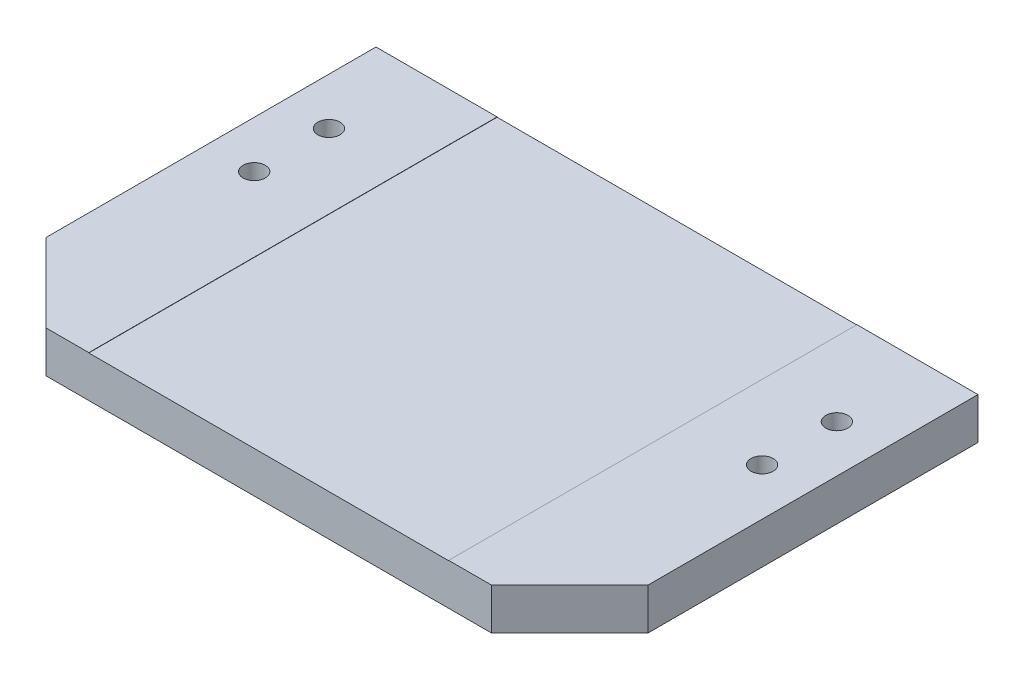
ISO-10303-21;
HEADER;
FILE_DESCRIPTION(('STEP AP214'),'2;1');
FILE_NAME('part.step','',(''),(''),'','','');
FILE_SCHEMA(('AUTOMOTIVE_DESIGN { 1 0 10303 214 1 1 1 1 }'));
ENDSEC;
DATA;
#1=APPLICATION_CONTEXT('core data for automotive mechanical design processes');
#2=APPLICATION_PROTOCOL_DEFINITION('international standard','automotive_design',2000,#1);
#3=PRODUCT_CONTEXT('',#1,'mechanical');
#4=PRODUCT('Part','Part','',(#3));
#5=PRODUCT_RELATED_PRODUCT_CATEGORY('part','',(#4));
#6=PRODUCT_DEFINITION_FORMATION('','',#4);
#7=PRODUCT_DEFINITION_CONTEXT('part definition',#1,'design');
#8=PRODUCT_DEFINITION('design','',#6,#7);
#9=PRODUCT_DEFINITION_SHAPE('','',#8);
#10=(LENGTH_UNIT() NAMED_UNIT(*) SI_UNIT(.MILLI.,.METRE.));
#11=(NAMED_UNIT(*) PLANE_ANGLE_UNIT() SI_UNIT($,.RADIAN.));
#12=(NAMED_UNIT(*) SI_UNIT($,.STERADIAN.) SOLID_ANGLE_UNIT());
#13=UNCERTAINTY_MEASURE_WITH_UNIT(LENGTH_MEASURE(1.E-05),#10,'distance_accuracy_value','');
#14=(GEOMETRIC_REPRESENTATION_CONTEXT(3) GLOBAL_UNCERTAINTY_ASSIGNED_CONTEXT((#13)) GLOBAL_UNIT_ASSIGNED_CONTEXT((#10,
#11,#12)) REPRESENTATION_CONTEXT('',''));
#15=CARTESIAN_POINT('',(0.,0.,0.));
#16=DIRECTION('',(0.,0.,1.));
#17=DIRECTION('',(1.,0.,0.));
#18=AXIS2_PLACEMENT_3D('',#15,#16,#17);
#19=CARTESIAN_POINT('',(0.,1.5,0.));
#20=DIRECTION('',(0.,-1.,0.));
#21=DIRECTION('',(0.,0.,-1.));
#22=AXIS2_PLACEMENT_3D('',#19,#20,#21);
#23=PLANE('',#22);
#24=CARTESIAN_POINT('',(-9.175,1.5,-3.975));
#25=DIRECTION('',(0.,1.,0.));
#26=DIRECTION('',(0.,0.,1.));
#27=AXIS2_PLACEMENT_3D('',#24,#25,#26);
#28=CIRCLE('',#27,0.4);
#29=CARTESIAN_POINT('',(-9.175,1.5,-3.575));
#30=VERTEX_POINT('',#29);
#31=EDGE_CURVE('E262',#30,#30,#28,.T.);
#32=ORIENTED_EDGE('',*,*,#31,.F.);
#33=EDGE_LOOP('',(#32));
#34=FACE_BOUND('',#33,.T.);
#35=CARTESIAN_POINT('',(-9.175,1.5,-1.275));
#36=DIRECTION('',(0.,1.,0.));
#37=DIRECTION('',(0.,0.,1.));
#38=AXIS2_PLACEMENT_3D('',#35,#36,#37);
#39=CIRCLE('',#38,0.399999999999999);
#40=CARTESIAN_POINT('',(-9.175,1.5,-0.874999999999999));
#41=VERTEX_POINT('',#40);
#42=EDGE_CURVE('E157',#41,#41,#39,.T.);
#43=ORIENTED_EDGE('',*,*,#42,.F.);
#44=EDGE_LOOP('',(#43));
#45=FACE_BOUND('',#44,.T.);
#46=DIRECTION('',(1.,0.,0.));
#47=VECTOR('',#46,1.);
#48=CARTESIAN_POINT('',(8.04657287525381,1.5,7.375));
#49=LINE('',#48,#47);
#50=CARTESIAN_POINT('',(-8.04657287525381,1.5,7.375));
#51=VERTEX_POINT('',#50);
#52=CARTESIAN_POINT('',(-6.5,1.5,7.375));
#53=VERTEX_POINT('',#52);
#54=EDGE_CURVE('E128',#51,#53,#49,.T.);
#55=ORIENTED_EDGE('',*,*,#54,.T.);
#56=DIRECTION('',(0.,0.,1.));
#57=VECTOR('',#56,1.);
#58=CARTESIAN_POINT('',(-6.5,1.5,-7.375));
#59=LINE('',#58,#57);
#60=CARTESIAN_POINT('',(-6.5,1.5,-7.375));
#61=VERTEX_POINT('',#60);
#62=EDGE_CURVE('E216',#61,#53,#59,.T.);
#63=ORIENTED_EDGE('',*,*,#62,.F.);
#64=DIRECTION('',(-1.,0.,0.));
#65=VECTOR('',#64,1.);
#66=CARTESIAN_POINT('',(-10.875,1.5,-7.375));
#67=LINE('',#66,#65);
#68=CARTESIAN_POINT('',(-10.875,1.5,-7.375));
#69=VERTEX_POINT('',#68);
#70=EDGE_CURVE('E66',#61,#69,#67,.T.);
#71=ORIENTED_EDGE('',*,*,#70,.T.);
#72=DIRECTION('',(0.,0.,1.));
#73=VECTOR('',#72,1.);
#74=CARTESIAN_POINT('',(-10.875,1.5,4.54657287525381));
#75=LINE('',#74,#73);
#76=CARTESIAN_POINT('',(-10.875,1.5,4.54657287525381));
#77=VERTEX_POINT('',#76);
#78=EDGE_CURVE('E170',#69,#77,#75,.T.);
#79=ORIENTED_EDGE('',*,*,#78,.T.);
#80=DIRECTION('',(0.707106781186547,0.,0.707106781186548));
#81=VECTOR('',#80,1.);
#82=CARTESIAN_POINT('',(-8.04657287525381,1.5,7.375));
#83=LINE('',#82,#81);
#84=EDGE_CURVE('E102',#77,#51,#83,.T.);
#85=ORIENTED_EDGE('',*,*,#84,.T.);
#86=EDGE_LOOP('',(#55,#63,#71,#79,#85));
#87=FACE_BOUND('',#86,.T.);
#88=ADVANCED_FACE('F41',(#34,#45,#87),#23,.F.);
#89=CARTESIAN_POINT('',(10.875,1.5,-7.375));
#90=VERTEX_POINT('',#89);
#91=CARTESIAN_POINT('',(6.5,1.5,-7.375));
#92=VERTEX_POINT('',#91);
#93=EDGE_CURVE('E146',#90,#92,#67,.T.);
#94=ORIENTED_EDGE('',*,*,#93,.T.);
#95=DIRECTION('',(0.,0.,-1.));
#96=VECTOR('',#95,1.);
#97=CARTESIAN_POINT('',(6.5,1.5,-7.375));
#98=LINE('',#97,#96);
#99=CARTESIAN_POINT('',(6.5,1.5,7.375));
#100=VERTEX_POINT('',#99);
#101=EDGE_CURVE('E196',#100,#92,#98,.T.);
#102=ORIENTED_EDGE('',*,*,#101,.F.);
#103=CARTESIAN_POINT('',(8.04657287525381,1.5,7.375));
#104=VERTEX_POINT('',#103);
#105=EDGE_CURVE('E123',#100,#104,#49,.T.);
#106=ORIENTED_EDGE('',*,*,#105,.T.);
#107=DIRECTION('',(0.707106781186548,0.,-0.707106781186547));
#108=VECTOR('',#107,1.);
#109=CARTESIAN_POINT('',(10.875,1.5,4.54657287525381));
#110=LINE('',#109,#108);
#111=CARTESIAN_POINT('',(10.875,1.5,4.54657287525381));
#112=VERTEX_POINT('',#111);
#113=EDGE_CURVE('E113',#104,#112,#110,.T.);
#114=ORIENTED_EDGE('',*,*,#113,.T.);
#115=DIRECTION('',(0.,0.,-1.));
#116=VECTOR('',#115,1.);
#117=CARTESIAN_POINT('',(10.875,1.5,-7.375));
#118=LINE('',#117,#116);
#119=EDGE_CURVE('E119',#112,#90,#118,.T.);
#120=ORIENTED_EDGE('',*,*,#119,.T.);
#121=EDGE_LOOP('',(#94,#102,#106,#114,#120));
#122=FACE_BOUND('',#121,.T.);
#123=CARTESIAN_POINT('',(9.175,1.5,-1.275));
#124=DIRECTION('',(0.,1.,0.));
#125=DIRECTION('',(0.,0.,1.));
#126=AXIS2_PLACEMENT_3D('',#123,#124,#125);
#127=CIRCLE('',#126,0.399999999999999);
#128=CARTESIAN_POINT('',(9.175,1.5,-0.875));
#129=VERTEX_POINT('',#128);
#130=EDGE_CURVE('E254',#129,#129,#127,.T.);
#131=ORIENTED_EDGE('',*,*,#130,.F.);
#132=EDGE_LOOP('',(#131));
#133=FACE_BOUND('',#132,.T.);
#134=CARTESIAN_POINT('',(9.175,1.5,-3.975));
#135=DIRECTION('',(0.,1.,0.));
#136=DIRECTION('',(0.,0.,1.));
#137=AXIS2_PLACEMENT_3D('',#134,#135,#136);
#138=CIRCLE('',#137,0.4);
#139=CARTESIAN_POINT('',(9.175,1.5,-3.575));
#140=VERTEX_POINT('',#139);
#141=EDGE_CURVE('E246',#140,#140,#138,.T.);
#142=ORIENTED_EDGE('',*,*,#141,.F.);
#143=EDGE_LOOP('',(#142));
#144=FACE_BOUND('',#143,.T.);
#145=ADVANCED_FACE('F116',(#122,#133,#144),#23,.F.);
#146=CARTESIAN_POINT('',(0.,0.,0.));
#147=DIRECTION('',(0.,-1.,0.));
#148=DIRECTION('',(0.,0.,-1.));
#149=AXIS2_PLACEMENT_3D('',#146,#147,#148);
#150=PLANE('',#149);
#151=CARTESIAN_POINT('',(9.175,0.,-1.275));
#152=DIRECTION('',(0.,1.,0.));
#153=DIRECTION('',(0.,0.,1.));
#154=AXIS2_PLACEMENT_3D('',#151,#152,#153);
#155=CIRCLE('',#154,0.399999999999999);
#156=CARTESIAN_POINT('',(9.175,0.,-0.875));
#157=VERTEX_POINT('',#156);
#158=EDGE_CURVE('E250',#157,#157,#155,.T.);
#159=ORIENTED_EDGE('',*,*,#158,.T.);
#160=EDGE_LOOP('',(#159));
#161=FACE_BOUND('',#160,.T.);
#162=CARTESIAN_POINT('',(-9.175,0.,-1.275));
#163=DIRECTION('',(0.,1.,0.));
#164=DIRECTION('',(0.,0.,1.));
#165=AXIS2_PLACEMENT_3D('',#162,#163,#164);
#166=CIRCLE('',#165,0.399999999999999);
#167=CARTESIAN_POINT('',(-9.175,0.,-0.874999999999999));
#168=VERTEX_POINT('',#167);
#169=EDGE_CURVE('E266',#168,#168,#166,.T.);
#170=ORIENTED_EDGE('',*,*,#169,.T.);
#171=EDGE_LOOP('',(#170));
#172=FACE_BOUND('',#171,.T.);
#173=DIRECTION('',(0.,0.,1.));
#174=VECTOR('',#173,1.);
#175=CARTESIAN_POINT('',(-10.875,0.,4.54657287525381));
#176=LINE('',#175,#174);
#177=CARTESIAN_POINT('',(-10.875,0.,-7.375));
#178=VERTEX_POINT('',#177);
#179=CARTESIAN_POINT('',(-10.875,0.,4.54657287525381));
#180=VERTEX_POINT('',#179);
#181=EDGE_CURVE('E152',#178,#180,#176,.T.);
#182=ORIENTED_EDGE('',*,*,#181,.F.);
#183=DIRECTION('',(-1.,0.,0.));
#184=VECTOR('',#183,1.);
#185=CARTESIAN_POINT('',(-10.875,0.,-7.375));
#186=LINE('',#185,#184);
#187=CARTESIAN_POINT('',(10.875,0.,-7.375));
#188=VERTEX_POINT('',#187);
#189=EDGE_CURVE('E94',#188,#178,#186,.T.);
#190=ORIENTED_EDGE('',*,*,#189,.F.);
#191=DIRECTION('',(0.,0.,-1.));
#192=VECTOR('',#191,1.);
#193=CARTESIAN_POINT('',(10.875,0.,-7.375));
#194=LINE('',#193,#192);
#195=CARTESIAN_POINT('',(10.875,0.,4.54657287525381));
#196=VERTEX_POINT('',#195);
#197=EDGE_CURVE('E165',#196,#188,#194,.T.);
#198=ORIENTED_EDGE('',*,*,#197,.F.);
#199=DIRECTION('',(0.707106781186548,0.,-0.707106781186547));
#200=VECTOR('',#199,1.);
#201=CARTESIAN_POINT('',(10.875,0.,4.54657287525381));
#202=LINE('',#201,#200);
#203=CARTESIAN_POINT('',(8.04657287525381,0.,7.375));
#204=VERTEX_POINT('',#203);
#205=EDGE_CURVE('E134',#204,#196,#202,.T.);
#206=ORIENTED_EDGE('',*,*,#205,.F.);
#207=DIRECTION('',(1.,0.,0.));
#208=VECTOR('',#207,1.);
#209=CARTESIAN_POINT('',(8.04657287525381,0.,7.375));
#210=LINE('',#209,#208);
#211=CARTESIAN_POINT('',(-8.04657287525381,0.,7.375));
#212=VERTEX_POINT('',#211);
#213=EDGE_CURVE('E160',#212,#204,#210,.T.);
#214=ORIENTED_EDGE('',*,*,#213,.F.);
#215=DIRECTION('',(0.707106781186547,0.,0.707106781186548));
#216=VECTOR('',#215,1.);
#217=CARTESIAN_POINT('',(-8.04657287525381,0.,7.375));
#218=LINE('',#217,#216);
#219=EDGE_CURVE('E156',#180,#212,#218,.T.);
#220=ORIENTED_EDGE('',*,*,#219,.F.);
#221=EDGE_LOOP('',(#182,#190,#198,#206,#214,#220));
#222=FACE_BOUND('',#221,.T.);
#223=CARTESIAN_POINT('',(-9.175,0.,-3.975));
#224=DIRECTION('',(0.,1.,0.));
#225=DIRECTION('',(0.,0.,1.));
#226=AXIS2_PLACEMENT_3D('',#223,#224,#225);
#227=CIRCLE('',#226,0.4);
#228=CARTESIAN_POINT('',(-9.175,0.,-3.575));
#229=VERTEX_POINT('',#228);
#230=EDGE_CURVE('E258',#229,#229,#227,.T.);
#231=ORIENTED_EDGE('',*,*,#230,.T.);
#232=EDGE_LOOP('',(#231));
#233=FACE_BOUND('',#232,.T.);
#234=CARTESIAN_POINT('',(9.175,0.,-3.975));
#235=DIRECTION('',(0.,1.,0.));
#236=DIRECTION('',(0.,0.,1.));
#237=AXIS2_PLACEMENT_3D('',#234,#235,#236);
#238=CIRCLE('',#237,0.4);
#239=CARTESIAN_POINT('',(9.175,0.,-3.575));
#240=VERTEX_POINT('',#239);
#241=EDGE_CURVE('E241',#240,#240,#238,.T.);
#242=ORIENTED_EDGE('',*,*,#241,.T.);
#243=EDGE_LOOP('',(#242));
#244=FACE_BOUND('',#243,.T.);
#245=ADVANCED_FACE('F187',(#161,#172,#222,#233,#244),#150,.T.);
#246=CARTESIAN_POINT('',(-10.875,1.5,4.54657287525381));
#247=DIRECTION('',(1.,0.,0.));
#248=DIRECTION('',(0.,0.,-1.));
#249=AXIS2_PLACEMENT_3D('',#246,#247,#248);
#250=PLANE('',#249);
#251=ORIENTED_EDGE('',*,*,#181,.T.);
#252=DIRECTION('',(0.,-1.,0.));
#253=VECTOR('',#252,1.);
#254=CARTESIAN_POINT('',(-10.875,1.5,4.54657287525381));
#255=LINE('',#254,#253);
#256=EDGE_CURVE('E11',#77,#180,#255,.T.);
#257=ORIENTED_EDGE('',*,*,#256,.F.);
#258=ORIENTED_EDGE('',*,*,#78,.F.);
#259=DIRECTION('',(0.,-1.,0.));
#260=VECTOR('',#259,1.);
#261=CARTESIAN_POINT('',(-10.875,1.5,-7.375));
#262=LINE('',#261,#260);
#263=EDGE_CURVE('E151',#69,#178,#262,.T.);
#264=ORIENTED_EDGE('',*,*,#263,.T.);
#265=EDGE_LOOP('',(#251,#257,#258,#264));
#266=FACE_BOUND('',#265,.T.);
#267=ADVANCED_FACE('F43',(#266),#250,.F.);
#268=CARTESIAN_POINT('',(-8.04657287525381,1.5,7.375));
#269=DIRECTION('',(0.707106781186548,0.,-0.707106781186547));
#270=DIRECTION('',(-0.707106781186547,0.,-0.707106781186548));
#271=AXIS2_PLACEMENT_3D('',#268,#269,#270);
#272=PLANE('',#271);
#273=ORIENTED_EDGE('',*,*,#219,.T.);
#274=DIRECTION('',(0.,-1.,0.));
#275=VECTOR('',#274,1.);
#276=CARTESIAN_POINT('',(-8.04657287525381,1.5,7.375));
#277=LINE('',#276,#275);
#278=EDGE_CURVE('E50',#51,#212,#277,.T.);
#279=ORIENTED_EDGE('',*,*,#278,.F.);
#280=ORIENTED_EDGE('',*,*,#84,.F.);
#281=ORIENTED_EDGE('',*,*,#256,.T.);
#282=EDGE_LOOP('',(#273,#279,#280,#281));
#283=FACE_BOUND('',#282,.T.);
#284=ADVANCED_FACE('F284',(#283),#272,.F.);
#285=CARTESIAN_POINT('',(8.04657287525381,1.5,7.375));
#286=DIRECTION('',(0.,0.,-1.));
#287=DIRECTION('',(-1.,0.,0.));
#288=AXIS2_PLACEMENT_3D('',#285,#286,#287);
#289=PLANE('',#288);
#290=DIRECTION('',(1.,0.,0.));
#291=VECTOR('',#290,1.);
#292=CARTESIAN_POINT('',(-6.5,1.49,7.375));
#293=LINE('',#292,#291);
#294=CARTESIAN_POINT('',(-6.5,1.49,7.375));
#295=VERTEX_POINT('',#294);
#296=CARTESIAN_POINT('',(6.5,1.49,7.375));
#297=VERTEX_POINT('',#296);
#298=EDGE_CURVE('E222',#295,#297,#293,.T.);
#299=ORIENTED_EDGE('',*,*,#298,.F.);
#300=DIRECTION('',(0.,1.,0.));
#301=VECTOR('',#300,1.);
#302=CARTESIAN_POINT('',(-6.5,1.49,7.375));
#303=LINE('',#302,#301);
#304=EDGE_CURVE('E212',#295,#53,#303,.T.);
#305=ORIENTED_EDGE('',*,*,#304,.T.);
#306=ORIENTED_EDGE('',*,*,#54,.F.);
#307=ORIENTED_EDGE('',*,*,#278,.T.);
#308=ORIENTED_EDGE('',*,*,#213,.T.);
#309=DIRECTION('',(0.,-1.,0.));
#310=VECTOR('',#309,1.);
#311=CARTESIAN_POINT('',(8.04657287525381,1.5,7.375));
#312=LINE('',#311,#310);
#313=EDGE_CURVE('E138',#104,#204,#312,.T.);
#314=ORIENTED_EDGE('',*,*,#313,.F.);
#315=ORIENTED_EDGE('',*,*,#105,.F.);
#316=DIRECTION('',(0.,1.,0.));
#317=VECTOR('',#316,1.);
#318=CARTESIAN_POINT('',(6.5,1.49,7.375));
#319=LINE('',#318,#317);
#320=EDGE_CURVE('E218',#297,#100,#319,.T.);
#321=ORIENTED_EDGE('',*,*,#320,.F.);
#322=EDGE_LOOP('',(#299,#305,#306,#307,#308,#314,#315,#321));
#323=FACE_BOUND('',#322,.T.);
#324=ADVANCED_FACE('F182',(#323),#289,.F.);
#325=CARTESIAN_POINT('',(10.875,1.5,4.54657287525381));
#326=DIRECTION('',(-0.707106781186547,0.,-0.707106781186548));
#327=DIRECTION('',(-0.707106781186548,0.,0.707106781186547));
#328=AXIS2_PLACEMENT_3D('',#325,#326,#327);
#329=PLANE('',#328);
#330=ORIENTED_EDGE('',*,*,#205,.T.);
#331=DIRECTION('',(0.,-1.,0.));
#332=VECTOR('',#331,1.);
#333=CARTESIAN_POINT('',(10.875,1.5,4.54657287525381));
#334=LINE('',#333,#332);
#335=EDGE_CURVE('E131',#112,#196,#334,.T.);
#336=ORIENTED_EDGE('',*,*,#335,.F.);
#337=ORIENTED_EDGE('',*,*,#113,.F.);
#338=ORIENTED_EDGE('',*,*,#313,.T.);
#339=EDGE_LOOP('',(#330,#336,#337,#338));
#340=FACE_BOUND('',#339,.T.);
#341=ADVANCED_FACE('F132',(#340),#329,.F.);
#342=CARTESIAN_POINT('',(10.875,1.5,-7.375));
#343=DIRECTION('',(-1.,0.,0.));
#344=DIRECTION('',(0.,0.,1.));
#345=AXIS2_PLACEMENT_3D('',#342,#343,#344);
#346=PLANE('',#345);
#347=ORIENTED_EDGE('',*,*,#197,.T.);
#348=DIRECTION('',(0.,-1.,0.));
#349=VECTOR('',#348,1.);
#350=CARTESIAN_POINT('',(10.875,1.5,-7.375));
#351=LINE('',#350,#349);
#352=EDGE_CURVE('E139',#90,#188,#351,.T.);
#353=ORIENTED_EDGE('',*,*,#352,.F.);
#354=ORIENTED_EDGE('',*,*,#119,.F.);
#355=ORIENTED_EDGE('',*,*,#335,.T.);
#356=EDGE_LOOP('',(#347,#353,#354,#355));
#357=FACE_BOUND('',#356,.T.);
#358=ADVANCED_FACE('F141',(#357),#346,.F.);
#359=CARTESIAN_POINT('',(-10.875,1.5,-7.375));
#360=DIRECTION('',(0.,0.,1.));
#361=DIRECTION('',(1.,0.,0.));
#362=AXIS2_PLACEMENT_3D('',#359,#360,#361);
#363=PLANE('',#362);
#364=ORIENTED_EDGE('',*,*,#70,.F.);
#365=DIRECTION('',(0.,1.,0.));
#366=VECTOR('',#365,1.);
#367=CARTESIAN_POINT('',(-6.5,1.49,-7.375));
#368=LINE('',#367,#366);
#369=CARTESIAN_POINT('',(-6.5,1.49,-7.375));
#370=VERTEX_POINT('',#369);
#371=EDGE_CURVE('E238',#370,#61,#368,.T.);
#372=ORIENTED_EDGE('',*,*,#371,.F.);
#373=DIRECTION('',(-1.,0.,0.));
#374=VECTOR('',#373,1.);
#375=CARTESIAN_POINT('',(-6.5,1.49,-7.375));
#376=LINE('',#375,#374);
#377=CARTESIAN_POINT('',(6.5,1.49,-7.375));
#378=VERTEX_POINT('',#377);
#379=EDGE_CURVE('E219',#378,#370,#376,.T.);
#380=ORIENTED_EDGE('',*,*,#379,.F.);
#381=DIRECTION('',(0.,1.,0.));
#382=VECTOR('',#381,1.);
#383=CARTESIAN_POINT('',(6.5,1.49,-7.375));
#384=LINE('',#383,#382);
#385=EDGE_CURVE('E193',#378,#92,#384,.T.);
#386=ORIENTED_EDGE('',*,*,#385,.T.);
#387=ORIENTED_EDGE('',*,*,#93,.F.);
#388=ORIENTED_EDGE('',*,*,#352,.T.);
#389=ORIENTED_EDGE('',*,*,#189,.T.);
#390=ORIENTED_EDGE('',*,*,#263,.F.);
#391=EDGE_LOOP('',(#364,#372,#380,#386,#387,#388,#389,#390));
#392=FACE_BOUND('',#391,.T.);
#393=ADVANCED_FACE('F189',(#392),#363,.F.);
#394=CARTESIAN_POINT('',(-9.175,1.5,-1.275));
#395=DIRECTION('',(0.,-1.,0.));
#396=DIRECTION('',(0.,0.,-1.));
#397=AXIS2_PLACEMENT_3D('',#394,#395,#396);
#398=CYLINDRICAL_SURFACE('',#397,0.399999999999999);
#399=ORIENTED_EDGE('',*,*,#42,.T.);
#400=EDGE_LOOP('',(#399));
#401=FACE_BOUND('',#400,.T.);
#402=ORIENTED_EDGE('',*,*,#169,.F.);
#403=EDGE_LOOP('',(#402));
#404=FACE_BOUND('',#403,.T.);
#405=ADVANCED_FACE('F301',(#401,#404),#398,.F.);
#406=CARTESIAN_POINT('',(-9.175,1.5,-3.975));
#407=DIRECTION('',(0.,-1.,0.));
#408=DIRECTION('',(0.,0.,-1.));
#409=AXIS2_PLACEMENT_3D('',#406,#407,#408);
#410=CYLINDRICAL_SURFACE('',#409,0.4);
#411=ORIENTED_EDGE('',*,*,#31,.T.);
#412=EDGE_LOOP('',(#411));
#413=FACE_BOUND('',#412,.T.);
#414=ORIENTED_EDGE('',*,*,#230,.F.);
#415=EDGE_LOOP('',(#414));
#416=FACE_BOUND('',#415,.T.);
#417=ADVANCED_FACE('F330',(#413,#416),#410,.F.);
#418=CARTESIAN_POINT('',(9.175,1.5,-1.275));
#419=DIRECTION('',(0.,-1.,0.));
#420=DIRECTION('',(0.,0.,-1.));
#421=AXIS2_PLACEMENT_3D('',#418,#419,#420);
#422=CYLINDRICAL_SURFACE('',#421,0.399999999999999);
#423=ORIENTED_EDGE('',*,*,#130,.T.);
#424=EDGE_LOOP('',(#423));
#425=FACE_BOUND('',#424,.T.);
#426=ORIENTED_EDGE('',*,*,#158,.F.);
#427=EDGE_LOOP('',(#426));
#428=FACE_BOUND('',#427,.T.);
#429=ADVANCED_FACE('F337',(#425,#428),#422,.F.);
#430=CARTESIAN_POINT('',(9.175,1.5,-3.975));
#431=DIRECTION('',(0.,-1.,0.));
#432=DIRECTION('',(0.,0.,-1.));
#433=AXIS2_PLACEMENT_3D('',#430,#431,#432);
#434=CYLINDRICAL_SURFACE('',#433,0.4);
#435=ORIENTED_EDGE('',*,*,#141,.T.);
#436=EDGE_LOOP('',(#435));
#437=FACE_BOUND('',#436,.T.);
#438=ORIENTED_EDGE('',*,*,#241,.F.);
#439=EDGE_LOOP('',(#438));
#440=FACE_BOUND('',#439,.T.);
#441=ADVANCED_FACE('F344',(#437,#440),#434,.F.);
#442=CARTESIAN_POINT('',(-6.5,1.49,-7.375));
#443=DIRECTION('',(-1.,0.,0.));
#444=DIRECTION('',(0.,0.,1.));
#445=AXIS2_PLACEMENT_3D('',#442,#443,#444);
#446=PLANE('',#445);
#447=ORIENTED_EDGE('',*,*,#62,.T.);
#448=ORIENTED_EDGE('',*,*,#304,.F.);
#449=DIRECTION('',(0.,0.,1.));
#450=VECTOR('',#449,1.);
#451=CARTESIAN_POINT('',(-6.5,1.49,-7.375));
#452=LINE('',#451,#450);
#453=EDGE_CURVE('E215',#370,#295,#452,.T.);
#454=ORIENTED_EDGE('',*,*,#453,.F.);
#455=ORIENTED_EDGE('',*,*,#371,.T.);
#456=EDGE_LOOP('',(#447,#448,#454,#455));
#457=FACE_BOUND('',#456,.T.);
#458=ADVANCED_FACE('F214',(#457),#446,.F.);
#459=CARTESIAN_POINT('',(6.5,1.49,-7.375));
#460=DIRECTION('',(1.,0.,0.));
#461=DIRECTION('',(0.,0.,-1.));
#462=AXIS2_PLACEMENT_3D('',#459,#460,#461);
#463=PLANE('',#462);
#464=ORIENTED_EDGE('',*,*,#101,.T.);
#465=ORIENTED_EDGE('',*,*,#385,.F.);
#466=DIRECTION('',(0.,0.,-1.));
#467=VECTOR('',#466,1.);
#468=CARTESIAN_POINT('',(6.5,1.49,-7.375));
#469=LINE('',#468,#467);
#470=EDGE_CURVE('E57',#297,#378,#469,.T.);
#471=ORIENTED_EDGE('',*,*,#470,.F.);
#472=ORIENTED_EDGE('',*,*,#320,.T.);
#473=EDGE_LOOP('',(#464,#465,#471,#472));
#474=FACE_BOUND('',#473,.T.);
#475=ADVANCED_FACE('F358',(#474),#463,.F.);
#476=CARTESIAN_POINT('',(0.,1.49,0.));
#477=DIRECTION('',(0.,1.,0.));
#478=DIRECTION('',(0.,0.,1.));
#479=AXIS2_PLACEMENT_3D('',#476,#477,#478);
#480=PLANE('',#479);
#481=ORIENTED_EDGE('',*,*,#453,.T.);
#482=ORIENTED_EDGE('',*,*,#298,.T.);
#483=ORIENTED_EDGE('',*,*,#470,.T.);
#484=ORIENTED_EDGE('',*,*,#379,.T.);
#485=EDGE_LOOP('',(#481,#482,#483,#484));
#486=FACE_BOUND('',#485,.T.);
#487=ADVANCED_FACE('F221',(#486),#480,.T.);
#488=CLOSED_SHELL('',(#88,#145,#245,#267,#284,#324,#341,#358,#393,#405,#417,#429,#441,#458,#475,#487));
#489=MANIFOLD_SOLID_BREP('B2',#488);
#490=ADVANCED_BREP_SHAPE_REPRESENTATION('',(#18,#489),#14);
#491=SHAPE_DEFINITION_REPRESENTATION(#9,#490);
ENDSEC;
END-ISO-10303-21;
